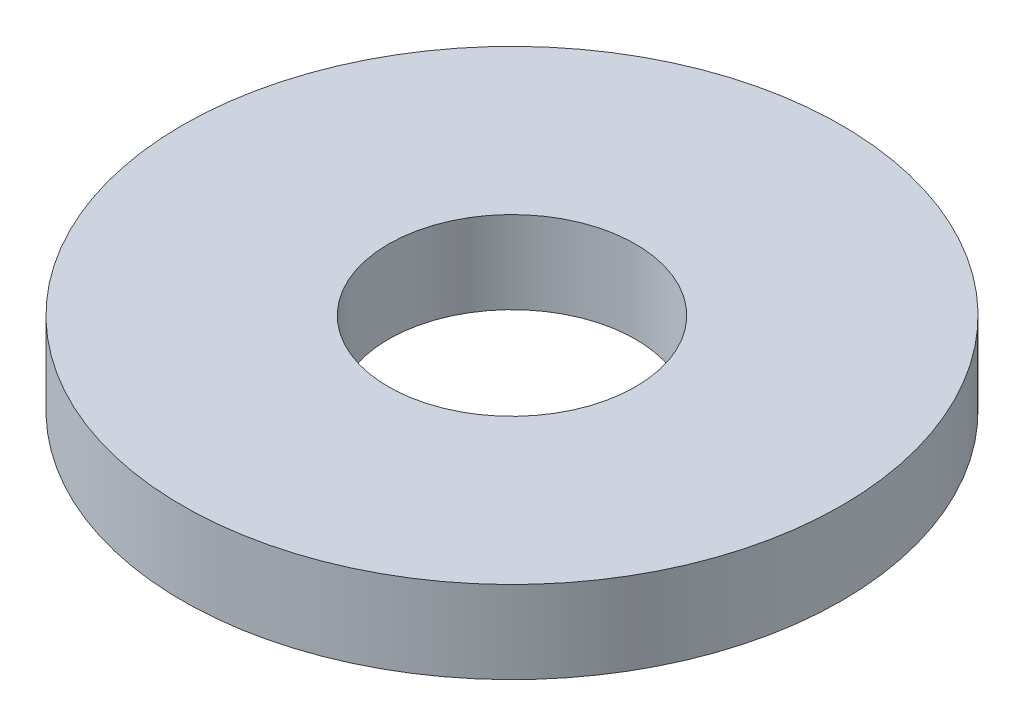
ISO-10303-21;
HEADER;
FILE_DESCRIPTION(('STEP AP214'),'2;1');
FILE_NAME('part.step','',(''),(''),'','','');
FILE_SCHEMA(('AUTOMOTIVE_DESIGN { 1 0 10303 214 1 1 1 1 }'));
ENDSEC;
DATA;
#1=APPLICATION_CONTEXT('core data for automotive mechanical design processes');
#2=APPLICATION_PROTOCOL_DEFINITION('international standard','automotive_design',2000,#1);
#3=PRODUCT_CONTEXT('',#1,'mechanical');
#4=PRODUCT('Part','Part','',(#3));
#5=PRODUCT_RELATED_PRODUCT_CATEGORY('part','',(#4));
#6=PRODUCT_DEFINITION_FORMATION('','',#4);
#7=PRODUCT_DEFINITION_CONTEXT('part definition',#1,'design');
#8=PRODUCT_DEFINITION('design','',#6,#7);
#9=PRODUCT_DEFINITION_SHAPE('','',#8);
#10=(LENGTH_UNIT() NAMED_UNIT(*) SI_UNIT(.MILLI.,.METRE.));
#11=(NAMED_UNIT(*) PLANE_ANGLE_UNIT() SI_UNIT($,.RADIAN.));
#12=(NAMED_UNIT(*) SI_UNIT($,.STERADIAN.) SOLID_ANGLE_UNIT());
#13=UNCERTAINTY_MEASURE_WITH_UNIT(LENGTH_MEASURE(1.E-05),#10,'distance_accuracy_value','');
#14=(GEOMETRIC_REPRESENTATION_CONTEXT(3) GLOBAL_UNCERTAINTY_ASSIGNED_CONTEXT((#13)) GLOBAL_UNIT_ASSIGNED_CONTEXT((#10,
#11,#12)) REPRESENTATION_CONTEXT('',''));
#15=CARTESIAN_POINT('',(0.,0.,0.));
#16=DIRECTION('',(0.,0.,1.));
#17=DIRECTION('',(1.,0.,0.));
#18=AXIS2_PLACEMENT_3D('',#15,#16,#17);
#19=CARTESIAN_POINT('',(0.,-0.5,0.));
#20=DIRECTION('',(0.,-1.,0.));
#21=DIRECTION('',(1.,0.,0.));
#22=AXIS2_PLACEMENT_3D('',#19,#20,#21);
#23=CYLINDRICAL_SURFACE('',#22,1.5);
#24=CARTESIAN_POINT('',(0.,-0.500000000000001,0.));
#25=DIRECTION('',(0.,-1.,0.));
#26=DIRECTION('',(1.,0.,0.));
#27=AXIS2_PLACEMENT_3D('',#24,#25,#26);
#28=CIRCLE('',#27,1.5);
#29=CARTESIAN_POINT('',(1.5,-0.5,0.));
#30=VERTEX_POINT('',#29);
#31=EDGE_CURVE('E10',#30,#30,#28,.T.);
#32=ORIENTED_EDGE('',*,*,#31,.T.);
#33=EDGE_LOOP('',(#32));
#34=FACE_BOUND('',#33,.T.);
#35=CARTESIAN_POINT('',(0.,0.5,0.));
#36=DIRECTION('',(0.,-1.,0.));
#37=DIRECTION('',(1.,0.,0.));
#38=AXIS2_PLACEMENT_3D('',#35,#36,#37);
#39=CIRCLE('',#38,1.5);
#40=CARTESIAN_POINT('',(1.5,0.5,0.));
#41=VERTEX_POINT('',#40);
#42=EDGE_CURVE('E52',#41,#41,#39,.T.);
#43=ORIENTED_EDGE('',*,*,#42,.F.);
#44=EDGE_LOOP('',(#43));
#45=FACE_BOUND('',#44,.T.);
#46=ADVANCED_FACE('F34',(#34,#45),#23,.F.);
#47=CARTESIAN_POINT('',(1.5,-0.500000000000001,0.));
#48=DIRECTION('',(0.,-1.,0.));
#49=DIRECTION('',(1.,0.,0.));
#50=AXIS2_PLACEMENT_3D('',#47,#48,#49);
#51=PLANE('',#50);
#52=CARTESIAN_POINT('',(0.,-0.500000000000002,0.));
#53=DIRECTION('',(0.,-1.,0.));
#54=DIRECTION('',(1.,0.,0.));
#55=AXIS2_PLACEMENT_3D('',#52,#53,#54);
#56=CIRCLE('',#55,4.);
#57=CARTESIAN_POINT('',(4.,-0.5,0.));
#58=VERTEX_POINT('',#57);
#59=EDGE_CURVE('E41',#58,#58,#56,.T.);
#60=ORIENTED_EDGE('',*,*,#59,.T.);
#61=EDGE_LOOP('',(#60));
#62=FACE_BOUND('',#61,.T.);
#63=ORIENTED_EDGE('',*,*,#31,.F.);
#64=EDGE_LOOP('',(#63));
#65=FACE_BOUND('',#64,.T.);
#66=ADVANCED_FACE('F62',(#62,#65),#51,.T.);
#67=CARTESIAN_POINT('',(0.,-0.5,0.));
#68=DIRECTION('',(0.,-1.,0.));
#69=DIRECTION('',(1.,0.,0.));
#70=AXIS2_PLACEMENT_3D('',#67,#68,#69);
#71=CYLINDRICAL_SURFACE('',#70,4.);
#72=CARTESIAN_POINT('',(0.,0.499999999999998,0.));
#73=DIRECTION('',(0.,-1.,0.));
#74=DIRECTION('',(1.,0.,0.));
#75=AXIS2_PLACEMENT_3D('',#72,#73,#74);
#76=CIRCLE('',#75,4.);
#77=CARTESIAN_POINT('',(4.,0.5,0.));
#78=VERTEX_POINT('',#77);
#79=EDGE_CURVE('E48',#78,#78,#76,.T.);
#80=ORIENTED_EDGE('',*,*,#79,.T.);
#81=EDGE_LOOP('',(#80));
#82=FACE_BOUND('',#81,.T.);
#83=ORIENTED_EDGE('',*,*,#59,.F.);
#84=EDGE_LOOP('',(#83));
#85=FACE_BOUND('',#84,.T.);
#86=ADVANCED_FACE('F66',(#82,#85),#71,.T.);
#87=CARTESIAN_POINT('',(1.5,0.499999999999999,0.));
#88=DIRECTION('',(0.,1.,0.));
#89=DIRECTION('',(-1.,0.,0.));
#90=AXIS2_PLACEMENT_3D('',#87,#88,#89);
#91=PLANE('',#90);
#92=ORIENTED_EDGE('',*,*,#42,.T.);
#93=EDGE_LOOP('',(#92));
#94=FACE_BOUND('',#93,.T.);
#95=ORIENTED_EDGE('',*,*,#79,.F.);
#96=EDGE_LOOP('',(#95));
#97=FACE_BOUND('',#96,.T.);
#98=ADVANCED_FACE('F58',(#94,#97),#91,.T.);
#99=CLOSED_SHELL('',(#46,#66,#86,#98));
#100=MANIFOLD_SOLID_BREP('B2',#99);
#101=ADVANCED_BREP_SHAPE_REPRESENTATION('',(#18,#100),#14);
#102=SHAPE_DEFINITION_REPRESENTATION(#9,#101);
ENDSEC;
END-ISO-10303-21;
